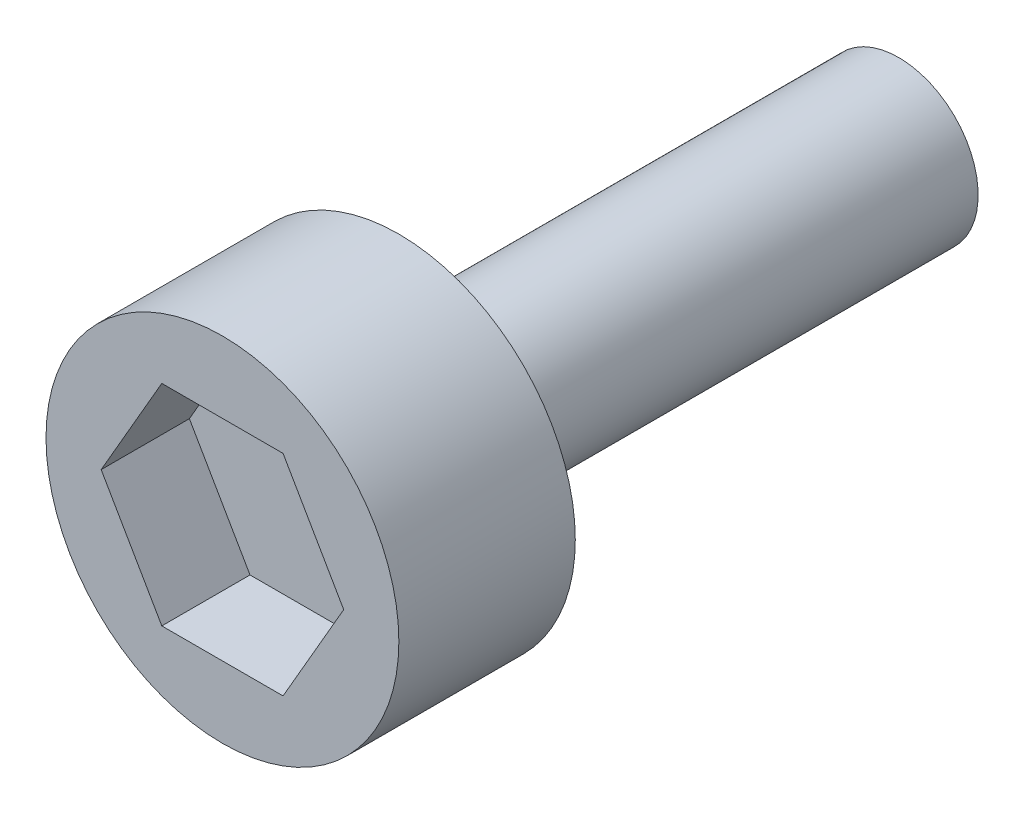
ISO-10303-21;
HEADER;
FILE_DESCRIPTION(('STEP AP214'),'2;1');
FILE_NAME('part.step','',(''),(''),'','','');
FILE_SCHEMA(('AUTOMOTIVE_DESIGN { 1 0 10303 214 1 1 1 1 }'));
ENDSEC;
DATA;
#1=APPLICATION_CONTEXT('core data for automotive mechanical design processes');
#2=APPLICATION_PROTOCOL_DEFINITION('international standard','automotive_design',2000,#1);
#3=PRODUCT_CONTEXT('',#1,'mechanical');
#4=PRODUCT('Part','Part','',(#3));
#5=PRODUCT_RELATED_PRODUCT_CATEGORY('part','',(#4));
#6=PRODUCT_DEFINITION_FORMATION('','',#4);
#7=PRODUCT_DEFINITION_CONTEXT('part definition',#1,'design');
#8=PRODUCT_DEFINITION('design','',#6,#7);
#9=PRODUCT_DEFINITION_SHAPE('','',#8);
#10=(LENGTH_UNIT() NAMED_UNIT(*) SI_UNIT(.MILLI.,.METRE.));
#11=(NAMED_UNIT(*) PLANE_ANGLE_UNIT() SI_UNIT($,.RADIAN.));
#12=(NAMED_UNIT(*) SI_UNIT($,.STERADIAN.) SOLID_ANGLE_UNIT());
#13=UNCERTAINTY_MEASURE_WITH_UNIT(LENGTH_MEASURE(1.E-05),#10,'distance_accuracy_value','');
#14=(GEOMETRIC_REPRESENTATION_CONTEXT(3) GLOBAL_UNCERTAINTY_ASSIGNED_CONTEXT((#13)) GLOBAL_UNIT_ASSIGNED_CONTEXT((#10,
#11,#12)) REPRESENTATION_CONTEXT('',''));
#15=CARTESIAN_POINT('',(0.,0.,0.));
#16=DIRECTION('',(0.,0.,1.));
#17=DIRECTION('',(1.,0.,0.));
#18=AXIS2_PLACEMENT_3D('',#15,#16,#17);
#19=CARTESIAN_POINT('',(0.,0.,3.));
#20=DIRECTION('',(0.,0.,-1.));
#21=DIRECTION('',(-1.,0.,0.));
#22=AXIS2_PLACEMENT_3D('',#19,#20,#21);
#23=CYLINDRICAL_SURFACE('',#22,3.);
#24=CARTESIAN_POINT('',(0.,0.,3.));
#25=DIRECTION('',(0.,0.,1.));
#26=DIRECTION('',(1.,0.,0.));
#27=AXIS2_PLACEMENT_3D('',#24,#25,#26);
#28=CIRCLE('',#27,3.);
#29=CARTESIAN_POINT('',(3.,0.,3.));
#30=VERTEX_POINT('',#29);
#31=EDGE_CURVE('E54',#30,#30,#28,.T.);
#32=ORIENTED_EDGE('',*,*,#31,.F.);
#33=EDGE_LOOP('',(#32));
#34=FACE_BOUND('',#33,.T.);
#35=CARTESIAN_POINT('',(0.,0.,0.));
#36=DIRECTION('',(0.,0.,1.));
#37=DIRECTION('',(1.,0.,0.));
#38=AXIS2_PLACEMENT_3D('',#35,#36,#37);
#39=CIRCLE('',#38,3.);
#40=CARTESIAN_POINT('',(3.,0.,0.));
#41=VERTEX_POINT('',#40);
#42=EDGE_CURVE('E48',#41,#41,#39,.T.);
#43=ORIENTED_EDGE('',*,*,#42,.T.);
#44=EDGE_LOOP('',(#43));
#45=FACE_BOUND('',#44,.T.);
#46=ADVANCED_FACE('F45',(#34,#45),#23,.T.);
#47=CARTESIAN_POINT('',(0.,0.,3.));
#48=DIRECTION('',(0.,0.,1.));
#49=DIRECTION('',(1.,0.,0.));
#50=AXIS2_PLACEMENT_3D('',#47,#48,#49);
#51=PLANE('',#50);
#52=DIRECTION('',(0.499999999999995,0.866025403784441,0.));
#53=VECTOR('',#52,1.);
#54=CARTESIAN_POINT('',(1.03095389520766,-1.78566452676066,3.));
#55=LINE('',#54,#53);
#56=CARTESIAN_POINT('',(1.03095389520766,-1.78566452676066,3.));
#57=VERTEX_POINT('',#56);
#58=CARTESIAN_POINT('',(2.06190779041527,0.,3.));
#59=VERTEX_POINT('',#58);
#60=EDGE_CURVE('E62',#57,#59,#55,.T.);
#61=ORIENTED_EDGE('',*,*,#60,.F.);
#62=DIRECTION('',(1.,0.,0.));
#63=VECTOR('',#62,1.);
#64=CARTESIAN_POINT('',(-1.03095389520762,-1.78566452676068,3.));
#65=LINE('',#64,#63);
#66=CARTESIAN_POINT('',(-1.03095389520762,-1.78566452676068,3.));
#67=VERTEX_POINT('',#66);
#68=EDGE_CURVE('E156',#67,#57,#65,.T.);
#69=ORIENTED_EDGE('',*,*,#68,.F.);
#70=DIRECTION('',(0.500000000000007,-0.866025403784435,0.));
#71=VECTOR('',#70,1.);
#72=CARTESIAN_POINT('',(-2.06190779041527,0.,3.));
#73=LINE('',#72,#71);
#74=CARTESIAN_POINT('',(-2.06190779041527,0.,3.));
#75=VERTEX_POINT('',#74);
#76=EDGE_CURVE('E153',#75,#67,#73,.T.);
#77=ORIENTED_EDGE('',*,*,#76,.F.);
#78=DIRECTION('',(-0.499999999999995,-0.866025403784441,0.));
#79=VECTOR('',#78,1.);
#80=CARTESIAN_POINT('',(-1.03095389520765,1.78566452676066,3.));
#81=LINE('',#80,#79);
#82=CARTESIAN_POINT('',(-1.03095389520765,1.78566452676066,3.));
#83=VERTEX_POINT('',#82);
#84=EDGE_CURVE('E110',#83,#75,#81,.T.);
#85=ORIENTED_EDGE('',*,*,#84,.F.);
#86=DIRECTION('',(-1.,0.,0.));
#87=VECTOR('',#86,1.);
#88=CARTESIAN_POINT('',(1.03095389520763,1.78566452676067,3.));
#89=LINE('',#88,#87);
#90=CARTESIAN_POINT('',(1.03095389520763,1.78566452676067,3.));
#91=VERTEX_POINT('',#90);
#92=EDGE_CURVE('E147',#91,#83,#89,.T.);
#93=ORIENTED_EDGE('',*,*,#92,.F.);
#94=DIRECTION('',(-0.500000000000001,0.866025403784438,0.));
#95=VECTOR('',#94,1.);
#96=CARTESIAN_POINT('',(2.06190779041527,0.,3.));
#97=LINE('',#96,#95);
#98=EDGE_CURVE('E142',#59,#91,#97,.T.);
#99=ORIENTED_EDGE('',*,*,#98,.F.);
#100=EDGE_LOOP('',(#61,#69,#77,#85,#93,#99));
#101=FACE_BOUND('',#100,.T.);
#102=ORIENTED_EDGE('',*,*,#31,.T.);
#103=EDGE_LOOP('',(#102));
#104=FACE_BOUND('',#103,.T.);
#105=ADVANCED_FACE('F182',(#101,#104),#51,.T.);
#106=CARTESIAN_POINT('',(0.,0.,0.));
#107=DIRECTION('',(0.,0.,1.));
#108=DIRECTION('',(1.,0.,0.));
#109=AXIS2_PLACEMENT_3D('',#106,#107,#108);
#110=PLANE('',#109);
#111=CARTESIAN_POINT('',(0.,0.,0.));
#112=DIRECTION('',(0.,0.,-1.));
#113=DIRECTION('',(-1.,0.,0.));
#114=AXIS2_PLACEMENT_3D('',#111,#112,#113);
#115=CIRCLE('',#114,1.35);
#116=CARTESIAN_POINT('',(-1.35,0.,0.));
#117=VERTEX_POINT('',#116);
#118=EDGE_CURVE('E11',#117,#117,#115,.T.);
#119=ORIENTED_EDGE('',*,*,#118,.F.);
#120=EDGE_LOOP('',(#119));
#121=FACE_BOUND('',#120,.T.);
#122=ORIENTED_EDGE('',*,*,#42,.F.);
#123=EDGE_LOOP('',(#122));
#124=FACE_BOUND('',#123,.T.);
#125=ADVANCED_FACE('F179',(#121,#124),#110,.F.);
#126=CARTESIAN_POINT('',(1.03095389520766,-1.78566452676066,1.5));
#127=DIRECTION('',(0.866025403784441,-0.499999999999995,0.));
#128=DIRECTION('',(0.499999999999995,0.866025403784441,0.));
#129=AXIS2_PLACEMENT_3D('',#126,#127,#128);
#130=PLANE('',#129);
#131=ORIENTED_EDGE('',*,*,#60,.T.);
#132=DIRECTION('',(0.,0.,1.));
#133=VECTOR('',#132,1.);
#134=CARTESIAN_POINT('',(2.06190779041527,0.,1.5));
#135=LINE('',#134,#133);
#136=CARTESIAN_POINT('',(2.06190779041527,0.,1.5));
#137=VERTEX_POINT('',#136);
#138=EDGE_CURVE('E92',#137,#59,#135,.T.);
#139=ORIENTED_EDGE('',*,*,#138,.F.);
#140=DIRECTION('',(0.499999999999995,0.866025403784441,0.));
#141=VECTOR('',#140,1.);
#142=CARTESIAN_POINT('',(1.03095389520766,-1.78566452676066,1.5));
#143=LINE('',#142,#141);
#144=CARTESIAN_POINT('',(1.03095389520766,-1.78566452676066,1.5));
#145=VERTEX_POINT('',#144);
#146=EDGE_CURVE('E159',#145,#137,#143,.T.);
#147=ORIENTED_EDGE('',*,*,#146,.F.);
#148=DIRECTION('',(0.,0.,1.));
#149=VECTOR('',#148,1.);
#150=CARTESIAN_POINT('',(1.03095389520766,-1.78566452676066,1.5));
#151=LINE('',#150,#149);
#152=EDGE_CURVE('E70',#145,#57,#151,.T.);
#153=ORIENTED_EDGE('',*,*,#152,.T.);
#154=EDGE_LOOP('',(#131,#139,#147,#153));
#155=FACE_BOUND('',#154,.T.);
#156=ADVANCED_FACE('F181',(#155),#130,.F.);
#157=CARTESIAN_POINT('',(-1.03095389520762,-1.78566452676068,1.5));
#158=DIRECTION('',(0.,-1.,0.));
#159=DIRECTION('',(1.,0.,0.));
#160=AXIS2_PLACEMENT_3D('',#157,#158,#159);
#161=PLANE('',#160);
#162=ORIENTED_EDGE('',*,*,#68,.T.);
#163=ORIENTED_EDGE('',*,*,#152,.F.);
#164=DIRECTION('',(1.,0.,0.));
#165=VECTOR('',#164,1.);
#166=CARTESIAN_POINT('',(-1.03095389520762,-1.78566452676068,1.5));
#167=LINE('',#166,#165);
#168=CARTESIAN_POINT('',(-1.03095389520762,-1.78566452676068,1.5));
#169=VERTEX_POINT('',#168);
#170=EDGE_CURVE('E124',#169,#145,#167,.T.);
#171=ORIENTED_EDGE('',*,*,#170,.F.);
#172=DIRECTION('',(0.,0.,1.));
#173=VECTOR('',#172,1.);
#174=CARTESIAN_POINT('',(-1.03095389520762,-1.78566452676068,1.5));
#175=LINE('',#174,#173);
#176=EDGE_CURVE('E115',#169,#67,#175,.T.);
#177=ORIENTED_EDGE('',*,*,#176,.T.);
#178=EDGE_LOOP('',(#162,#163,#171,#177));
#179=FACE_BOUND('',#178,.T.);
#180=ADVANCED_FACE('F189',(#179),#161,.F.);
#181=CARTESIAN_POINT('',(-2.06190779041527,0.,1.5));
#182=DIRECTION('',(-0.866025403784435,-0.500000000000007,0.));
#183=DIRECTION('',(0.500000000000007,-0.866025403784434,0.));
#184=AXIS2_PLACEMENT_3D('',#181,#182,#183);
#185=PLANE('',#184);
#186=ORIENTED_EDGE('',*,*,#76,.T.);
#187=ORIENTED_EDGE('',*,*,#176,.F.);
#188=DIRECTION('',(0.500000000000007,-0.866025403784435,0.));
#189=VECTOR('',#188,1.);
#190=CARTESIAN_POINT('',(-2.06190779041527,0.,1.5));
#191=LINE('',#190,#189);
#192=CARTESIAN_POINT('',(-2.06190779041527,0.,1.5));
#193=VERTEX_POINT('',#192);
#194=EDGE_CURVE('E119',#193,#169,#191,.T.);
#195=ORIENTED_EDGE('',*,*,#194,.F.);
#196=DIRECTION('',(0.,0.,1.));
#197=VECTOR('',#196,1.);
#198=CARTESIAN_POINT('',(-2.06190779041527,0.,1.5));
#199=LINE('',#198,#197);
#200=EDGE_CURVE('E103',#193,#75,#199,.T.);
#201=ORIENTED_EDGE('',*,*,#200,.T.);
#202=EDGE_LOOP('',(#186,#187,#195,#201));
#203=FACE_BOUND('',#202,.T.);
#204=ADVANCED_FACE('F120',(#203),#185,.F.);
#205=CARTESIAN_POINT('',(-1.03095389520765,1.78566452676066,1.5));
#206=DIRECTION('',(-0.866025403784442,0.499999999999995,0.));
#207=DIRECTION('',(-0.499999999999995,-0.866025403784442,0.));
#208=AXIS2_PLACEMENT_3D('',#205,#206,#207);
#209=PLANE('',#208);
#210=ORIENTED_EDGE('',*,*,#84,.T.);
#211=ORIENTED_EDGE('',*,*,#200,.F.);
#212=DIRECTION('',(-0.499999999999995,-0.866025403784441,0.));
#213=VECTOR('',#212,1.);
#214=CARTESIAN_POINT('',(-1.03095389520765,1.78566452676066,1.5));
#215=LINE('',#214,#213);
#216=CARTESIAN_POINT('',(-1.03095389520765,1.78566452676066,1.5));
#217=VERTEX_POINT('',#216);
#218=EDGE_CURVE('E107',#217,#193,#215,.T.);
#219=ORIENTED_EDGE('',*,*,#218,.F.);
#220=DIRECTION('',(0.,0.,1.));
#221=VECTOR('',#220,1.);
#222=CARTESIAN_POINT('',(-1.03095389520765,1.78566452676066,1.5));
#223=LINE('',#222,#221);
#224=EDGE_CURVE('E116',#217,#83,#223,.T.);
#225=ORIENTED_EDGE('',*,*,#224,.T.);
#226=EDGE_LOOP('',(#210,#211,#219,#225));
#227=FACE_BOUND('',#226,.T.);
#228=ADVANCED_FACE('F105',(#227),#209,.F.);
#229=CARTESIAN_POINT('',(1.03095389520763,1.78566452676067,1.5));
#230=DIRECTION('',(0.,1.,0.));
#231=DIRECTION('',(-1.,0.,0.));
#232=AXIS2_PLACEMENT_3D('',#229,#230,#231);
#233=PLANE('',#232);
#234=ORIENTED_EDGE('',*,*,#92,.T.);
#235=ORIENTED_EDGE('',*,*,#224,.F.);
#236=DIRECTION('',(-1.,0.,0.));
#237=VECTOR('',#236,1.);
#238=CARTESIAN_POINT('',(1.03095389520763,1.78566452676067,1.5));
#239=LINE('',#238,#237);
#240=CARTESIAN_POINT('',(1.03095389520763,1.78566452676067,1.5));
#241=VERTEX_POINT('',#240);
#242=EDGE_CURVE('E130',#241,#217,#239,.T.);
#243=ORIENTED_EDGE('',*,*,#242,.F.);
#244=DIRECTION('',(0.,0.,1.));
#245=VECTOR('',#244,1.);
#246=CARTESIAN_POINT('',(1.03095389520763,1.78566452676067,1.5));
#247=LINE('',#246,#245);
#248=EDGE_CURVE('E166',#241,#91,#247,.T.);
#249=ORIENTED_EDGE('',*,*,#248,.T.);
#250=EDGE_LOOP('',(#234,#235,#243,#249));
#251=FACE_BOUND('',#250,.T.);
#252=ADVANCED_FACE('F230',(#251),#233,.F.);
#253=CARTESIAN_POINT('',(2.06190779041527,0.,1.5));
#254=DIRECTION('',(0.866025403784438,0.500000000000001,0.));
#255=DIRECTION('',(-0.500000000000001,0.866025403784438,0.));
#256=AXIS2_PLACEMENT_3D('',#253,#254,#255);
#257=PLANE('',#256);
#258=ORIENTED_EDGE('',*,*,#98,.T.);
#259=ORIENTED_EDGE('',*,*,#248,.F.);
#260=DIRECTION('',(-0.500000000000001,0.866025403784438,0.));
#261=VECTOR('',#260,1.);
#262=CARTESIAN_POINT('',(2.06190779041527,0.,1.5));
#263=LINE('',#262,#261);
#264=EDGE_CURVE('E134',#137,#241,#263,.T.);
#265=ORIENTED_EDGE('',*,*,#264,.F.);
#266=ORIENTED_EDGE('',*,*,#138,.T.);
#267=EDGE_LOOP('',(#258,#259,#265,#266));
#268=FACE_BOUND('',#267,.T.);
#269=ADVANCED_FACE('F238',(#268),#257,.F.);
#270=CARTESIAN_POINT('',(0.,0.,1.5));
#271=DIRECTION('',(0.,0.,1.));
#272=DIRECTION('',(1.,0.,0.));
#273=AXIS2_PLACEMENT_3D('',#270,#271,#272);
#274=PLANE('',#273);
#275=ORIENTED_EDGE('',*,*,#146,.T.);
#276=ORIENTED_EDGE('',*,*,#264,.T.);
#277=ORIENTED_EDGE('',*,*,#242,.T.);
#278=ORIENTED_EDGE('',*,*,#218,.T.);
#279=ORIENTED_EDGE('',*,*,#194,.T.);
#280=ORIENTED_EDGE('',*,*,#170,.T.);
#281=EDGE_LOOP('',(#275,#276,#277,#278,#279,#280));
#282=FACE_BOUND('',#281,.T.);
#283=ADVANCED_FACE('F127',(#282),#274,.T.);
#284=CARTESIAN_POINT('',(0.,0.,-8.5));
#285=DIRECTION('',(0.,0.,1.));
#286=DIRECTION('',(1.,0.,0.));
#287=AXIS2_PLACEMENT_3D('',#284,#285,#286);
#288=CYLINDRICAL_SURFACE('',#287,1.35);
#289=CARTESIAN_POINT('',(0.,0.,-8.5));
#290=DIRECTION('',(0.,0.,-1.));
#291=DIRECTION('',(-1.,0.,0.));
#292=AXIS2_PLACEMENT_3D('',#289,#290,#291);
#293=CIRCLE('',#292,1.35);
#294=CARTESIAN_POINT('',(-1.35,0.,-8.5));
#295=VERTEX_POINT('',#294);
#296=EDGE_CURVE('E143',#295,#295,#293,.T.);
#297=ORIENTED_EDGE('',*,*,#296,.F.);
#298=EDGE_LOOP('',(#297));
#299=FACE_BOUND('',#298,.T.);
#300=ORIENTED_EDGE('',*,*,#118,.T.);
#301=EDGE_LOOP('',(#300));
#302=FACE_BOUND('',#301,.T.);
#303=ADVANCED_FACE('F253',(#299,#302),#288,.T.);
#304=CARTESIAN_POINT('',(0.,0.,-8.5));
#305=DIRECTION('',(0.,0.,-1.));
#306=DIRECTION('',(-1.,0.,0.));
#307=AXIS2_PLACEMENT_3D('',#304,#305,#306);
#308=PLANE('',#307);
#309=ORIENTED_EDGE('',*,*,#296,.T.);
#310=EDGE_LOOP('',(#309));
#311=FACE_BOUND('',#310,.T.);
#312=ADVANCED_FACE('F264',(#311),#308,.T.);
#313=CLOSED_SHELL('',(#46,#105,#125,#156,#180,#204,#228,#252,#269,#283,#303,#312));
#314=MANIFOLD_SOLID_BREP('B2',#313);
#315=ADVANCED_BREP_SHAPE_REPRESENTATION('',(#18,#314),#14);
#316=SHAPE_DEFINITION_REPRESENTATION(#9,#315);
ENDSEC;
END-ISO-10303-21;
